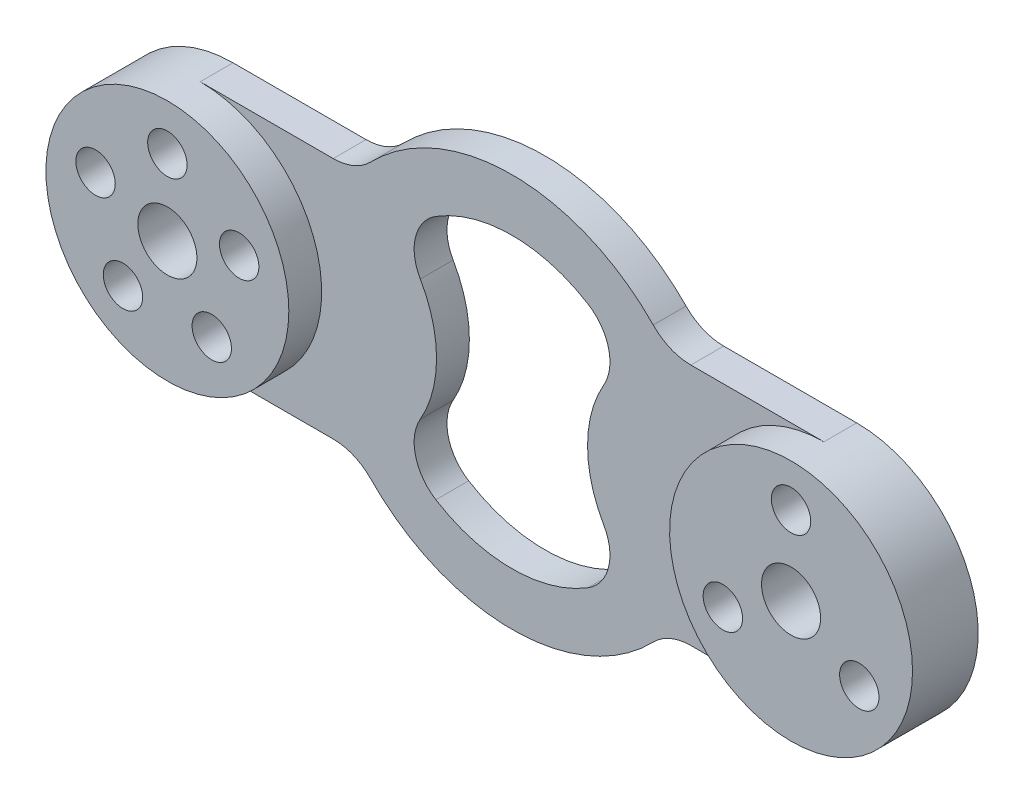
ISO-10303-21;
HEADER;
FILE_DESCRIPTION(('STEP AP214'),'2;1');
FILE_NAME('part.step','',(''),(''),'','','');
FILE_SCHEMA(('AUTOMOTIVE_DESIGN { 1 0 10303 214 1 1 1 1 }'));
ENDSEC;
DATA;
#1=APPLICATION_CONTEXT('core data for automotive mechanical design processes');
#2=APPLICATION_PROTOCOL_DEFINITION('international standard','automotive_design',2000,#1);
#3=PRODUCT_CONTEXT('',#1,'mechanical');
#4=PRODUCT('Part','Part','',(#3));
#5=PRODUCT_RELATED_PRODUCT_CATEGORY('part','',(#4));
#6=PRODUCT_DEFINITION_FORMATION('','',#4);
#7=PRODUCT_DEFINITION_CONTEXT('part definition',#1,'design');
#8=PRODUCT_DEFINITION('design','',#6,#7);
#9=PRODUCT_DEFINITION_SHAPE('','',#8);
#10=(LENGTH_UNIT() NAMED_UNIT(*) SI_UNIT(.MILLI.,.METRE.));
#11=(NAMED_UNIT(*) PLANE_ANGLE_UNIT() SI_UNIT($,.RADIAN.));
#12=(NAMED_UNIT(*) SI_UNIT($,.STERADIAN.) SOLID_ANGLE_UNIT());
#13=UNCERTAINTY_MEASURE_WITH_UNIT(LENGTH_MEASURE(1.E-05),#10,'distance_accuracy_value','');
#14=(GEOMETRIC_REPRESENTATION_CONTEXT(3) GLOBAL_UNCERTAINTY_ASSIGNED_CONTEXT((#13)) GLOBAL_UNIT_ASSIGNED_CONTEXT((#10,
#11,#12)) REPRESENTATION_CONTEXT('',''));
#15=CARTESIAN_POINT('',(0.,0.,0.));
#16=DIRECTION('',(0.,0.,1.));
#17=DIRECTION('',(1.,0.,0.));
#18=AXIS2_PLACEMENT_3D('',#15,#16,#17);
#19=CARTESIAN_POINT('',(54.4701753255853,53.,10.));
#20=DIRECTION('',(0.,0.,-1.));
#21=DIRECTION('',(-1.,0.,0.));
#22=AXIS2_PLACEMENT_3D('',#19,#20,#21);
#23=CYLINDRICAL_SURFACE('',#22,16.);
#24=CARTESIAN_POINT('',(54.4701753255853,53.,0.));
#25=DIRECTION('',(0.,0.,1.));
#26=DIRECTION('',(1.,0.,0.));
#27=AXIS2_PLACEMENT_3D('',#24,#25,#26);
#28=CIRCLE('',#27,16.);
#29=CARTESIAN_POINT('',(43.0027699938831,41.8421052631579,0.));
#30=VERTEX_POINT('',#29);
#31=CARTESIAN_POINT('',(54.4701753255853,37.,0.));
#32=VERTEX_POINT('',#31);
#33=EDGE_CURVE('E230',#30,#32,#28,.T.);
#34=ORIENTED_EDGE('',*,*,#33,.F.);
#35=DIRECTION('',(0.,0.,-1.));
#36=VECTOR('',#35,1.);
#37=CARTESIAN_POINT('',(43.0027699938831,41.8421052631579,10.));
#38=LINE('',#37,#36);
#39=CARTESIAN_POINT('',(43.0027699938831,41.8421052631579,10.));
#40=VERTEX_POINT('',#39);
#41=EDGE_CURVE('E11',#40,#30,#38,.T.);
#42=ORIENTED_EDGE('',*,*,#41,.F.);
#43=CARTESIAN_POINT('',(54.4701753255853,53.,10.));
#44=DIRECTION('',(0.,0.,1.));
#45=DIRECTION('',(1.,0.,0.));
#46=AXIS2_PLACEMENT_3D('',#43,#44,#45);
#47=CIRCLE('',#46,16.);
#48=CARTESIAN_POINT('',(54.4701753255853,37.,10.));
#49=VERTEX_POINT('',#48);
#50=EDGE_CURVE('E326',#40,#49,#47,.T.);
#51=ORIENTED_EDGE('',*,*,#50,.T.);
#52=DIRECTION('',(0.,0.,-1.));
#53=VECTOR('',#52,1.);
#54=CARTESIAN_POINT('',(54.4701753255853,37.,10.));
#55=LINE('',#54,#53);
#56=EDGE_CURVE('E122',#49,#32,#55,.T.);
#57=ORIENTED_EDGE('',*,*,#56,.T.);
#58=EDGE_LOOP('',(#34,#42,#51,#57));
#59=FACE_BOUND('',#58,.T.);
#60=ADVANCED_FACE('F36',(#59),#23,.F.);
#61=CARTESIAN_POINT('',(0.,0.,10.));
#62=DIRECTION('',(0.,0.,-1.));
#63=DIRECTION('',(-1.,0.,0.));
#64=AXIS2_PLACEMENT_3D('',#61,#62,#63);
#65=CYLINDRICAL_SURFACE('',#64,60.);
#66=CARTESIAN_POINT('',(0.,0.,0.));
#67=DIRECTION('',(0.,0.,1.));
#68=DIRECTION('',(1.,0.,0.));
#69=AXIS2_PLACEMENT_3D('',#66,#67,#68);
#70=CIRCLE('',#69,60.);
#71=CARTESIAN_POINT('',(-43.0027699938831,41.8421052631579,0.));
#72=VERTEX_POINT('',#71);
#73=EDGE_CURVE('E233',#30,#72,#70,.T.);
#74=ORIENTED_EDGE('',*,*,#73,.T.);
#75=DIRECTION('',(0.,0.,-1.));
#76=VECTOR('',#75,1.);
#77=CARTESIAN_POINT('',(-43.0027699938831,41.8421052631579,10.));
#78=LINE('',#77,#76);
#79=CARTESIAN_POINT('',(-43.0027699938831,41.8421052631579,10.));
#80=VERTEX_POINT('',#79);
#81=EDGE_CURVE('E46',#80,#72,#78,.T.);
#82=ORIENTED_EDGE('',*,*,#81,.F.);
#83=CARTESIAN_POINT('',(0.,0.,10.));
#84=DIRECTION('',(0.,0.,1.));
#85=DIRECTION('',(1.,0.,0.));
#86=AXIS2_PLACEMENT_3D('',#83,#84,#85);
#87=CIRCLE('',#86,60.);
#88=EDGE_CURVE('E328',#40,#80,#87,.T.);
#89=ORIENTED_EDGE('',*,*,#88,.F.);
#90=ORIENTED_EDGE('',*,*,#41,.T.);
#91=EDGE_LOOP('',(#74,#82,#89,#90));
#92=FACE_BOUND('',#91,.T.);
#93=ADVANCED_FACE('F412',(#92),#65,.T.);
#94=CARTESIAN_POINT('',(-54.4701753255853,53.,10.));
#95=DIRECTION('',(0.,0.,-1.));
#96=DIRECTION('',(-1.,0.,0.));
#97=AXIS2_PLACEMENT_3D('',#94,#95,#96);
#98=CYLINDRICAL_SURFACE('',#97,16.);
#99=CARTESIAN_POINT('',(-54.4701753255853,53.,0.));
#100=DIRECTION('',(0.,0.,1.));
#101=DIRECTION('',(1.,0.,0.));
#102=AXIS2_PLACEMENT_3D('',#99,#100,#101);
#103=CIRCLE('',#102,16.);
#104=CARTESIAN_POINT('',(-54.4701753255853,37.,0.));
#105=VERTEX_POINT('',#104);
#106=EDGE_CURVE('E236',#105,#72,#103,.T.);
#107=ORIENTED_EDGE('',*,*,#106,.F.);
#108=DIRECTION('',(0.,0.,-1.));
#109=VECTOR('',#108,1.);
#110=CARTESIAN_POINT('',(-54.4701753255853,37.,10.));
#111=LINE('',#110,#109);
#112=CARTESIAN_POINT('',(-54.4701753255853,37.,10.));
#113=VERTEX_POINT('',#112);
#114=EDGE_CURVE('E272',#113,#105,#111,.T.);
#115=ORIENTED_EDGE('',*,*,#114,.F.);
#116=CARTESIAN_POINT('',(-54.4701753255853,53.,10.));
#117=DIRECTION('',(0.,0.,1.));
#118=DIRECTION('',(1.,0.,0.));
#119=AXIS2_PLACEMENT_3D('',#116,#117,#118);
#120=CIRCLE('',#119,16.);
#121=EDGE_CURVE('E330',#113,#80,#120,.T.);
#122=ORIENTED_EDGE('',*,*,#121,.T.);
#123=ORIENTED_EDGE('',*,*,#81,.T.);
#124=EDGE_LOOP('',(#107,#115,#122,#123));
#125=FACE_BOUND('',#124,.T.);
#126=ADVANCED_FACE('F417',(#125),#98,.F.);
#127=CARTESIAN_POINT('',(0.,37.,10.));
#128=DIRECTION('',(0.,1.,0.));
#129=DIRECTION('',(-1.,0.,0.));
#130=AXIS2_PLACEMENT_3D('',#127,#128,#129);
#131=PLANE('',#130);
#132=DIRECTION('',(1.,0.,0.));
#133=VECTOR('',#132,1.);
#134=CARTESIAN_POINT('',(0.,37.,0.));
#135=LINE('',#134,#133);
#136=CARTESIAN_POINT('',(-95.,37.,0.));
#137=VERTEX_POINT('',#136);
#138=EDGE_CURVE('E239',#137,#105,#135,.T.);
#139=ORIENTED_EDGE('',*,*,#138,.F.);
#140=DIRECTION('',(0.,0.,-1.));
#141=VECTOR('',#140,1.);
#142=CARTESIAN_POINT('',(-95.,37.,10.));
#143=LINE('',#142,#141);
#144=CARTESIAN_POINT('',(-95.,37.,10.));
#145=VERTEX_POINT('',#144);
#146=EDGE_CURVE('E269',#145,#137,#143,.T.);
#147=ORIENTED_EDGE('',*,*,#146,.F.);
#148=DIRECTION('',(1.,0.,0.));
#149=VECTOR('',#148,1.);
#150=CARTESIAN_POINT('',(0.,37.,10.));
#151=LINE('',#150,#149);
#152=EDGE_CURVE('E333',#145,#113,#151,.T.);
#153=ORIENTED_EDGE('',*,*,#152,.T.);
#154=ORIENTED_EDGE('',*,*,#114,.T.);
#155=EDGE_LOOP('',(#139,#147,#153,#154));
#156=FACE_BOUND('',#155,.T.);
#157=ADVANCED_FACE('F376',(#156),#131,.T.);
#158=CARTESIAN_POINT('',(0.,-37.,10.));
#159=DIRECTION('',(0.,1.,0.));
#160=DIRECTION('',(0.,0.,1.));
#161=AXIS2_PLACEMENT_3D('',#158,#159,#160);
#162=PLANE('',#161);
#163=DIRECTION('',(1.,0.,0.));
#164=VECTOR('',#163,1.);
#165=CARTESIAN_POINT('',(0.,-37.,0.));
#166=LINE('',#165,#164);
#167=CARTESIAN_POINT('',(-95.,-37.,0.));
#168=VERTEX_POINT('',#167);
#169=CARTESIAN_POINT('',(-54.4701753255853,-37.,0.));
#170=VERTEX_POINT('',#169);
#171=EDGE_CURVE('E242',#168,#170,#166,.T.);
#172=ORIENTED_EDGE('',*,*,#171,.T.);
#173=DIRECTION('',(0.,0.,-1.));
#174=VECTOR('',#173,1.);
#175=CARTESIAN_POINT('',(-54.4701753255853,-37.,10.));
#176=LINE('',#175,#174);
#177=CARTESIAN_POINT('',(-54.4701753255853,-37.,10.));
#178=VERTEX_POINT('',#177);
#179=EDGE_CURVE('E264',#178,#170,#176,.T.);
#180=ORIENTED_EDGE('',*,*,#179,.F.);
#181=DIRECTION('',(1.,0.,0.));
#182=VECTOR('',#181,1.);
#183=CARTESIAN_POINT('',(0.,-37.,10.));
#184=LINE('',#183,#182);
#185=CARTESIAN_POINT('',(-95.,-37.,10.));
#186=VERTEX_POINT('',#185);
#187=EDGE_CURVE('E339',#186,#178,#184,.T.);
#188=ORIENTED_EDGE('',*,*,#187,.F.);
#189=DIRECTION('',(0.,0.,-1.));
#190=VECTOR('',#189,1.);
#191=CARTESIAN_POINT('',(-95.,-37.,10.));
#192=LINE('',#191,#190);
#193=EDGE_CURVE('E266',#186,#168,#192,.T.);
#194=ORIENTED_EDGE('',*,*,#193,.T.);
#195=EDGE_LOOP('',(#172,#180,#188,#194));
#196=FACE_BOUND('',#195,.T.);
#197=ADVANCED_FACE('F371',(#196),#162,.F.);
#198=CARTESIAN_POINT('',(-54.4701753255853,-53.,10.));
#199=DIRECTION('',(0.,0.,-1.));
#200=DIRECTION('',(-1.,0.,0.));
#201=AXIS2_PLACEMENT_3D('',#198,#199,#200);
#202=CYLINDRICAL_SURFACE('',#201,16.);
#203=CARTESIAN_POINT('',(-54.4701753255853,-53.,0.));
#204=DIRECTION('',(0.,0.,1.));
#205=DIRECTION('',(1.,0.,0.));
#206=AXIS2_PLACEMENT_3D('',#203,#204,#205);
#207=CIRCLE('',#206,16.);
#208=CARTESIAN_POINT('',(-43.0027699938831,-41.8421052631579,0.));
#209=VERTEX_POINT('',#208);
#210=EDGE_CURVE('E245',#209,#170,#207,.T.);
#211=ORIENTED_EDGE('',*,*,#210,.F.);
#212=DIRECTION('',(0.,0.,-1.));
#213=VECTOR('',#212,1.);
#214=CARTESIAN_POINT('',(-43.0027699938831,-41.8421052631579,10.));
#215=LINE('',#214,#213);
#216=CARTESIAN_POINT('',(-43.0027699938831,-41.8421052631579,10.));
#217=VERTEX_POINT('',#216);
#218=EDGE_CURVE('E191',#217,#209,#215,.T.);
#219=ORIENTED_EDGE('',*,*,#218,.F.);
#220=CARTESIAN_POINT('',(-54.4701753255853,-53.,10.));
#221=DIRECTION('',(0.,0.,1.));
#222=DIRECTION('',(1.,0.,0.));
#223=AXIS2_PLACEMENT_3D('',#220,#221,#222);
#224=CIRCLE('',#223,16.);
#225=EDGE_CURVE('E180',#217,#178,#224,.T.);
#226=ORIENTED_EDGE('',*,*,#225,.T.);
#227=ORIENTED_EDGE('',*,*,#179,.T.);
#228=EDGE_LOOP('',(#211,#219,#226,#227));
#229=FACE_BOUND('',#228,.T.);
#230=ADVANCED_FACE('F342',(#229),#202,.F.);
#231=CARTESIAN_POINT('',(0.,0.,10.));
#232=DIRECTION('',(0.,0.,-1.));
#233=DIRECTION('',(-1.,0.,0.));
#234=AXIS2_PLACEMENT_3D('',#231,#232,#233);
#235=CYLINDRICAL_SURFACE('',#234,60.);
#236=CARTESIAN_POINT('',(0.,0.,0.));
#237=DIRECTION('',(0.,0.,1.));
#238=DIRECTION('',(1.,0.,0.));
#239=AXIS2_PLACEMENT_3D('',#236,#237,#238);
#240=CIRCLE('',#239,60.);
#241=CARTESIAN_POINT('',(43.0027699938831,-41.8421052631579,0.));
#242=VERTEX_POINT('',#241);
#243=EDGE_CURVE('E187',#209,#242,#240,.T.);
#244=ORIENTED_EDGE('',*,*,#243,.T.);
#245=DIRECTION('',(0.,0.,-1.));
#246=VECTOR('',#245,1.);
#247=CARTESIAN_POINT('',(43.0027699938831,-41.8421052631579,10.));
#248=LINE('',#247,#246);
#249=CARTESIAN_POINT('',(43.0027699938831,-41.8421052631579,10.));
#250=VERTEX_POINT('',#249);
#251=EDGE_CURVE('E184',#250,#242,#248,.T.);
#252=ORIENTED_EDGE('',*,*,#251,.F.);
#253=CARTESIAN_POINT('',(0.,0.,10.));
#254=DIRECTION('',(0.,0.,1.));
#255=DIRECTION('',(1.,0.,0.));
#256=AXIS2_PLACEMENT_3D('',#253,#254,#255);
#257=CIRCLE('',#256,60.);
#258=EDGE_CURVE('E172',#217,#250,#257,.T.);
#259=ORIENTED_EDGE('',*,*,#258,.F.);
#260=ORIENTED_EDGE('',*,*,#218,.T.);
#261=EDGE_LOOP('',(#244,#252,#259,#260));
#262=FACE_BOUND('',#261,.T.);
#263=ADVANCED_FACE('F185',(#262),#235,.T.);
#264=CARTESIAN_POINT('',(54.4701753255853,-53.,10.));
#265=DIRECTION('',(0.,0.,-1.));
#266=DIRECTION('',(-1.,0.,0.));
#267=AXIS2_PLACEMENT_3D('',#264,#265,#266);
#268=CYLINDRICAL_SURFACE('',#267,16.);
#269=CARTESIAN_POINT('',(54.4701753255853,-53.,0.));
#270=DIRECTION('',(0.,0.,1.));
#271=DIRECTION('',(1.,0.,0.));
#272=AXIS2_PLACEMENT_3D('',#269,#270,#271);
#273=CIRCLE('',#272,16.);
#274=CARTESIAN_POINT('',(54.4701753255853,-37.,0.));
#275=VERTEX_POINT('',#274);
#276=EDGE_CURVE('E249',#275,#242,#273,.T.);
#277=ORIENTED_EDGE('',*,*,#276,.F.);
#278=DIRECTION('',(0.,0.,-1.));
#279=VECTOR('',#278,1.);
#280=CARTESIAN_POINT('',(54.4701753255853,-37.,10.));
#281=LINE('',#280,#279);
#282=CARTESIAN_POINT('',(54.4701753255853,-37.,10.));
#283=VERTEX_POINT('',#282);
#284=EDGE_CURVE('E192',#283,#275,#281,.T.);
#285=ORIENTED_EDGE('',*,*,#284,.F.);
#286=CARTESIAN_POINT('',(54.4701753255853,-53.,10.));
#287=DIRECTION('',(0.,0.,1.));
#288=DIRECTION('',(1.,0.,0.));
#289=AXIS2_PLACEMENT_3D('',#286,#287,#288);
#290=CIRCLE('',#289,16.);
#291=EDGE_CURVE('E177',#283,#250,#290,.T.);
#292=ORIENTED_EDGE('',*,*,#291,.T.);
#293=ORIENTED_EDGE('',*,*,#251,.T.);
#294=EDGE_LOOP('',(#277,#285,#292,#293));
#295=FACE_BOUND('',#294,.T.);
#296=ADVANCED_FACE('F194',(#295),#268,.F.);
#297=CARTESIAN_POINT('',(0.,-37.,10.));
#298=DIRECTION('',(0.,-1.,0.));
#299=DIRECTION('',(0.,0.,-1.));
#300=AXIS2_PLACEMENT_3D('',#297,#298,#299);
#301=PLANE('',#300);
#302=DIRECTION('',(-1.,0.,0.));
#303=VECTOR('',#302,1.);
#304=CARTESIAN_POINT('',(0.,-37.,0.));
#305=LINE('',#304,#303);
#306=CARTESIAN_POINT('',(95.,-37.,0.));
#307=VERTEX_POINT('',#306);
#308=EDGE_CURVE('E251',#307,#275,#305,.T.);
#309=ORIENTED_EDGE('',*,*,#308,.F.);
#310=DIRECTION('',(0.,0.,-1.));
#311=VECTOR('',#310,1.);
#312=CARTESIAN_POINT('',(95.,-37.,10.));
#313=LINE('',#312,#311);
#314=CARTESIAN_POINT('',(95.,-37.,10.));
#315=VERTEX_POINT('',#314);
#316=EDGE_CURVE('E260',#315,#307,#313,.T.);
#317=ORIENTED_EDGE('',*,*,#316,.F.);
#318=DIRECTION('',(-1.,0.,0.));
#319=VECTOR('',#318,1.);
#320=CARTESIAN_POINT('',(0.,-37.,10.));
#321=LINE('',#320,#319);
#322=EDGE_CURVE('E195',#315,#283,#321,.T.);
#323=ORIENTED_EDGE('',*,*,#322,.T.);
#324=ORIENTED_EDGE('',*,*,#284,.T.);
#325=EDGE_LOOP('',(#309,#317,#323,#324));
#326=FACE_BOUND('',#325,.T.);
#327=ADVANCED_FACE('F349',(#326),#301,.T.);
#328=CARTESIAN_POINT('',(15.825,-25.4866509176863,10.));
#329=DIRECTION('',(0.,0.,-1.));
#330=DIRECTION('',(-1.,0.,0.));
#331=AXIS2_PLACEMENT_3D('',#328,#329,#330);
#332=CYLINDRICAL_SURFACE('',#331,14.);
#333=CARTESIAN_POINT('',(15.825,-25.4866509176863,0.));
#334=DIRECTION('',(0.,0.,1.));
#335=DIRECTION('',(1.,0.,0.));
#336=AXIS2_PLACEMENT_3D('',#333,#334,#335);
#337=CIRCLE('',#336,14.);
#338=CARTESIAN_POINT('',(23.21,-37.3804213459399,0.));
#339=VERTEX_POINT('',#338);
#340=CARTESIAN_POINT('',(27.9514705882353,-18.4903153716548,0.));
#341=VERTEX_POINT('',#340);
#342=EDGE_CURVE('E205',#339,#341,#337,.T.);
#343=ORIENTED_EDGE('',*,*,#342,.F.);
#344=DIRECTION('',(0.,0.,-1.));
#345=VECTOR('',#344,1.);
#346=CARTESIAN_POINT('',(23.21,-37.3804213459399,10.));
#347=LINE('',#346,#345);
#348=CARTESIAN_POINT('',(23.21,-37.3804213459399,10.));
#349=VERTEX_POINT('',#348);
#350=EDGE_CURVE('E40',#349,#339,#347,.T.);
#351=ORIENTED_EDGE('',*,*,#350,.F.);
#352=CARTESIAN_POINT('',(15.825,-25.4866509176863,10.));
#353=DIRECTION('',(0.,0.,1.));
#354=DIRECTION('',(1.,0.,0.));
#355=AXIS2_PLACEMENT_3D('',#352,#353,#354);
#356=CIRCLE('',#355,14.);
#357=CARTESIAN_POINT('',(27.9514705882353,-18.4903153716548,10.));
#358=VERTEX_POINT('',#357);
#359=EDGE_CURVE('E255',#349,#358,#356,.T.);
#360=ORIENTED_EDGE('',*,*,#359,.T.);
#361=DIRECTION('',(0.,0.,-1.));
#362=VECTOR('',#361,1.);
#363=CARTESIAN_POINT('',(27.9514705882353,-18.4903153716548,10.));
#364=LINE('',#363,#362);
#365=EDGE_CURVE('E204',#358,#341,#364,.T.);
#366=ORIENTED_EDGE('',*,*,#365,.T.);
#367=EDGE_LOOP('',(#343,#351,#360,#366));
#368=FACE_BOUND('',#367,.T.);
#369=ADVANCED_FACE('F38',(#368),#332,.F.);
#370=CARTESIAN_POINT('',(0.,0.,10.));
#371=DIRECTION('',(0.,0.,-1.));
#372=DIRECTION('',(-1.,0.,0.));
#373=AXIS2_PLACEMENT_3D('',#370,#371,#372);
#374=CYLINDRICAL_SURFACE('',#373,44.);
#375=CARTESIAN_POINT('',(0.,0.,0.));
#376=DIRECTION('',(0.,0.,1.));
#377=DIRECTION('',(1.,0.,0.));
#378=AXIS2_PLACEMENT_3D('',#375,#376,#377);
#379=CIRCLE('',#378,44.);
#380=CARTESIAN_POINT('',(-23.21,-37.3804213459399,0.));
#381=VERTEX_POINT('',#380);
#382=EDGE_CURVE('E208',#381,#339,#379,.T.);
#383=ORIENTED_EDGE('',*,*,#382,.F.);
#384=DIRECTION('',(0.,0.,-1.));
#385=VECTOR('',#384,1.);
#386=CARTESIAN_POINT('',(-23.21,-37.3804213459399,10.));
#387=LINE('',#386,#385);
#388=CARTESIAN_POINT('',(-23.21,-37.3804213459399,10.));
#389=VERTEX_POINT('',#388);
#390=EDGE_CURVE('E285',#389,#381,#387,.T.);
#391=ORIENTED_EDGE('',*,*,#390,.F.);
#392=CARTESIAN_POINT('',(0.,0.,10.));
#393=DIRECTION('',(0.,0.,1.));
#394=DIRECTION('',(1.,0.,0.));
#395=AXIS2_PLACEMENT_3D('',#392,#393,#394);
#396=CIRCLE('',#395,44.);
#397=EDGE_CURVE('E294',#389,#349,#396,.T.);
#398=ORIENTED_EDGE('',*,*,#397,.T.);
#399=ORIENTED_EDGE('',*,*,#350,.T.);
#400=EDGE_LOOP('',(#383,#391,#398,#399));
#401=FACE_BOUND('',#400,.T.);
#402=ADVANCED_FACE('F292',(#401),#374,.F.);
#403=CARTESIAN_POINT('',(-15.825,-25.4866509176863,10.));
#404=DIRECTION('',(0.,0.,-1.));
#405=DIRECTION('',(-1.,0.,0.));
#406=AXIS2_PLACEMENT_3D('',#403,#404,#405);
#407=CYLINDRICAL_SURFACE('',#406,14.);
#408=CARTESIAN_POINT('',(-15.825,-25.4866509176863,0.));
#409=DIRECTION('',(0.,0.,1.));
#410=DIRECTION('',(1.,0.,0.));
#411=AXIS2_PLACEMENT_3D('',#408,#409,#410);
#412=CIRCLE('',#411,14.);
#413=CARTESIAN_POINT('',(-27.9514705882353,-18.4903153716548,0.));
#414=VERTEX_POINT('',#413);
#415=EDGE_CURVE('E212',#414,#381,#412,.T.);
#416=ORIENTED_EDGE('',*,*,#415,.F.);
#417=DIRECTION('',(0.,0.,-1.));
#418=VECTOR('',#417,1.);
#419=CARTESIAN_POINT('',(-27.9514705882353,-18.4903153716548,10.));
#420=LINE('',#419,#418);
#421=CARTESIAN_POINT('',(-27.9514705882353,-18.4903153716548,10.));
#422=VERTEX_POINT('',#421);
#423=EDGE_CURVE('E284',#422,#414,#420,.T.);
#424=ORIENTED_EDGE('',*,*,#423,.F.);
#425=CARTESIAN_POINT('',(-15.825,-25.4866509176863,10.));
#426=DIRECTION('',(0.,0.,1.));
#427=DIRECTION('',(1.,0.,0.));
#428=AXIS2_PLACEMENT_3D('',#425,#426,#427);
#429=CIRCLE('',#428,14.);
#430=EDGE_CURVE('E303',#422,#389,#429,.T.);
#431=ORIENTED_EDGE('',*,*,#430,.T.);
#432=ORIENTED_EDGE('',*,*,#390,.T.);
#433=EDGE_LOOP('',(#416,#424,#431,#432));
#434=FACE_BOUND('',#433,.T.);
#435=ADVANCED_FACE('F300',(#434),#407,.F.);
#436=CARTESIAN_POINT('',(-60.,0.,10.));
#437=DIRECTION('',(0.,0.,-1.));
#438=DIRECTION('',(-1.,0.,0.));
#439=AXIS2_PLACEMENT_3D('',#436,#437,#438);
#440=CYLINDRICAL_SURFACE('',#439,37.);
#441=CARTESIAN_POINT('',(-60.,0.,0.));
#442=DIRECTION('',(0.,0.,1.));
#443=DIRECTION('',(1.,0.,0.));
#444=AXIS2_PLACEMENT_3D('',#441,#442,#443);
#445=CIRCLE('',#444,37.);
#446=CARTESIAN_POINT('',(-27.9514705882353,18.4903153716548,0.));
#447=VERTEX_POINT('',#446);
#448=EDGE_CURVE('E215',#414,#447,#445,.T.);
#449=ORIENTED_EDGE('',*,*,#448,.T.);
#450=DIRECTION('',(0.,0.,-1.));
#451=VECTOR('',#450,1.);
#452=CARTESIAN_POINT('',(-27.9514705882353,18.4903153716548,10.));
#453=LINE('',#452,#451);
#454=CARTESIAN_POINT('',(-27.9514705882353,18.4903153716548,10.));
#455=VERTEX_POINT('',#454);
#456=EDGE_CURVE('E282',#455,#447,#453,.T.);
#457=ORIENTED_EDGE('',*,*,#456,.F.);
#458=CARTESIAN_POINT('',(-60.,0.,10.));
#459=DIRECTION('',(0.,0.,1.));
#460=DIRECTION('',(1.,0.,0.));
#461=AXIS2_PLACEMENT_3D('',#458,#459,#460);
#462=CIRCLE('',#461,37.);
#463=EDGE_CURVE('E306',#422,#455,#462,.T.);
#464=ORIENTED_EDGE('',*,*,#463,.F.);
#465=ORIENTED_EDGE('',*,*,#423,.T.);
#466=EDGE_LOOP('',(#449,#457,#464,#465));
#467=FACE_BOUND('',#466,.T.);
#468=ADVANCED_FACE('F307',(#467),#440,.T.);
#469=CARTESIAN_POINT('',(-15.825,25.4866509176863,10.));
#470=DIRECTION('',(0.,0.,-1.));
#471=DIRECTION('',(-1.,0.,0.));
#472=AXIS2_PLACEMENT_3D('',#469,#470,#471);
#473=CYLINDRICAL_SURFACE('',#472,14.);
#474=CARTESIAN_POINT('',(-15.825,25.4866509176863,0.));
#475=DIRECTION('',(0.,0.,1.));
#476=DIRECTION('',(1.,0.,0.));
#477=AXIS2_PLACEMENT_3D('',#474,#475,#476);
#478=CIRCLE('',#477,14.);
#479=CARTESIAN_POINT('',(-23.21,37.3804213459399,0.));
#480=VERTEX_POINT('',#479);
#481=EDGE_CURVE('E218',#480,#447,#478,.T.);
#482=ORIENTED_EDGE('',*,*,#481,.F.);
#483=DIRECTION('',(0.,0.,-1.));
#484=VECTOR('',#483,1.);
#485=CARTESIAN_POINT('',(-23.21,37.3804213459399,10.));
#486=LINE('',#485,#484);
#487=CARTESIAN_POINT('',(-23.21,37.3804213459399,10.));
#488=VERTEX_POINT('',#487);
#489=EDGE_CURVE('E280',#488,#480,#486,.T.);
#490=ORIENTED_EDGE('',*,*,#489,.F.);
#491=CARTESIAN_POINT('',(-15.825,25.4866509176863,10.));
#492=DIRECTION('',(0.,0.,1.));
#493=DIRECTION('',(1.,0.,0.));
#494=AXIS2_PLACEMENT_3D('',#491,#492,#493);
#495=CIRCLE('',#494,14.);
#496=EDGE_CURVE('E311',#488,#455,#495,.T.);
#497=ORIENTED_EDGE('',*,*,#496,.T.);
#498=ORIENTED_EDGE('',*,*,#456,.T.);
#499=EDGE_LOOP('',(#482,#490,#497,#498));
#500=FACE_BOUND('',#499,.T.);
#501=ADVANCED_FACE('F402',(#500),#473,.F.);
#502=CARTESIAN_POINT('',(0.,0.,10.));
#503=DIRECTION('',(0.,0.,-1.));
#504=DIRECTION('',(-1.,0.,0.));
#505=AXIS2_PLACEMENT_3D('',#502,#503,#504);
#506=CYLINDRICAL_SURFACE('',#505,44.);
#507=CARTESIAN_POINT('',(0.,0.,0.));
#508=DIRECTION('',(0.,0.,1.));
#509=DIRECTION('',(1.,0.,0.));
#510=AXIS2_PLACEMENT_3D('',#507,#508,#509);
#511=CIRCLE('',#510,44.);
#512=CARTESIAN_POINT('',(23.21,37.3804213459399,0.));
#513=VERTEX_POINT('',#512);
#514=EDGE_CURVE('E221',#513,#480,#511,.T.);
#515=ORIENTED_EDGE('',*,*,#514,.F.);
#516=DIRECTION('',(0.,0.,-1.));
#517=VECTOR('',#516,1.);
#518=CARTESIAN_POINT('',(23.21,37.3804213459399,10.));
#519=LINE('',#518,#517);
#520=CARTESIAN_POINT('',(23.21,37.3804213459399,10.));
#521=VERTEX_POINT('',#520);
#522=EDGE_CURVE('E278',#521,#513,#519,.T.);
#523=ORIENTED_EDGE('',*,*,#522,.F.);
#524=CARTESIAN_POINT('',(0.,0.,10.));
#525=DIRECTION('',(0.,0.,1.));
#526=DIRECTION('',(1.,0.,0.));
#527=AXIS2_PLACEMENT_3D('',#524,#525,#526);
#528=CIRCLE('',#527,44.);
#529=EDGE_CURVE('E318',#521,#488,#528,.T.);
#530=ORIENTED_EDGE('',*,*,#529,.T.);
#531=ORIENTED_EDGE('',*,*,#489,.T.);
#532=EDGE_LOOP('',(#515,#523,#530,#531));
#533=FACE_BOUND('',#532,.T.);
#534=ADVANCED_FACE('F399',(#533),#506,.F.);
#535=CARTESIAN_POINT('',(15.825,25.4866509176863,10.));
#536=DIRECTION('',(0.,0.,-1.));
#537=DIRECTION('',(-1.,0.,0.));
#538=AXIS2_PLACEMENT_3D('',#535,#536,#537);
#539=CYLINDRICAL_SURFACE('',#538,14.);
#540=CARTESIAN_POINT('',(15.825,25.4866509176863,0.));
#541=DIRECTION('',(0.,0.,1.));
#542=DIRECTION('',(1.,0.,0.));
#543=AXIS2_PLACEMENT_3D('',#540,#541,#542);
#544=CIRCLE('',#543,14.);
#545=CARTESIAN_POINT('',(27.9514705882353,18.4903153716548,0.));
#546=VERTEX_POINT('',#545);
#547=EDGE_CURVE('E224',#546,#513,#544,.T.);
#548=ORIENTED_EDGE('',*,*,#547,.F.);
#549=DIRECTION('',(0.,0.,-1.));
#550=VECTOR('',#549,1.);
#551=CARTESIAN_POINT('',(27.9514705882353,18.4903153716548,10.));
#552=LINE('',#551,#550);
#553=CARTESIAN_POINT('',(27.9514705882353,18.4903153716548,10.));
#554=VERTEX_POINT('',#553);
#555=EDGE_CURVE('E276',#554,#546,#552,.T.);
#556=ORIENTED_EDGE('',*,*,#555,.F.);
#557=CARTESIAN_POINT('',(15.825,25.4866509176863,10.));
#558=DIRECTION('',(0.,0.,1.));
#559=DIRECTION('',(1.,0.,0.));
#560=AXIS2_PLACEMENT_3D('',#557,#558,#559);
#561=CIRCLE('',#560,14.);
#562=EDGE_CURVE('E321',#554,#521,#561,.T.);
#563=ORIENTED_EDGE('',*,*,#562,.T.);
#564=ORIENTED_EDGE('',*,*,#522,.T.);
#565=EDGE_LOOP('',(#548,#556,#563,#564));
#566=FACE_BOUND('',#565,.T.);
#567=ADVANCED_FACE('F396',(#566),#539,.F.);
#568=CARTESIAN_POINT('',(60.,0.,10.));
#569=DIRECTION('',(0.,0.,-1.));
#570=DIRECTION('',(-1.,0.,0.));
#571=AXIS2_PLACEMENT_3D('',#568,#569,#570);
#572=CYLINDRICAL_SURFACE('',#571,37.);
#573=CARTESIAN_POINT('',(60.,0.,0.));
#574=DIRECTION('',(0.,0.,1.));
#575=DIRECTION('',(1.,0.,0.));
#576=AXIS2_PLACEMENT_3D('',#573,#574,#575);
#577=CIRCLE('',#576,37.);
#578=EDGE_CURVE('E227',#546,#341,#577,.T.);
#579=ORIENTED_EDGE('',*,*,#578,.T.);
#580=ORIENTED_EDGE('',*,*,#365,.F.);
#581=CARTESIAN_POINT('',(60.,0.,10.));
#582=DIRECTION('',(0.,0.,1.));
#583=DIRECTION('',(1.,0.,0.));
#584=AXIS2_PLACEMENT_3D('',#581,#582,#583);
#585=CIRCLE('',#584,37.);
#586=EDGE_CURVE('E324',#554,#358,#585,.T.);
#587=ORIENTED_EDGE('',*,*,#586,.F.);
#588=ORIENTED_EDGE('',*,*,#555,.T.);
#589=EDGE_LOOP('',(#579,#580,#587,#588));
#590=FACE_BOUND('',#589,.T.);
#591=ADVANCED_FACE('F393',(#590),#572,.T.);
#592=CARTESIAN_POINT('',(0.,37.,10.));
#593=DIRECTION('',(0.,-1.,0.));
#594=DIRECTION('',(1.,0.,0.));
#595=AXIS2_PLACEMENT_3D('',#592,#593,#594);
#596=PLANE('',#595);
#597=DIRECTION('',(-1.,0.,0.));
#598=VECTOR('',#597,1.);
#599=CARTESIAN_POINT('',(0.,37.,0.));
#600=LINE('',#599,#598);
#601=CARTESIAN_POINT('',(95.,37.,0.));
#602=VERTEX_POINT('',#601);
#603=EDGE_CURVE('E253',#602,#32,#600,.T.);
#604=ORIENTED_EDGE('',*,*,#603,.T.);
#605=ORIENTED_EDGE('',*,*,#56,.F.);
#606=DIRECTION('',(-1.,0.,0.));
#607=VECTOR('',#606,1.);
#608=CARTESIAN_POINT('',(0.,37.,10.));
#609=LINE('',#608,#607);
#610=CARTESIAN_POINT('',(95.,37.,10.));
#611=VERTEX_POINT('',#610);
#612=EDGE_CURVE('E55',#611,#49,#609,.T.);
#613=ORIENTED_EDGE('',*,*,#612,.F.);
#614=DIRECTION('',(0.,0.,-1.));
#615=VECTOR('',#614,1.);
#616=CARTESIAN_POINT('',(95.,37.,10.));
#617=LINE('',#616,#615);
#618=EDGE_CURVE('E257',#611,#602,#617,.T.);
#619=ORIENTED_EDGE('',*,*,#618,.T.);
#620=EDGE_LOOP('',(#604,#605,#613,#619));
#621=FACE_BOUND('',#620,.T.);
#622=ADVANCED_FACE('F424',(#621),#596,.F.);
#623=CARTESIAN_POINT('',(0.,0.,10.));
#624=DIRECTION('',(0.,0.,1.));
#625=DIRECTION('',(1.,0.,0.));
#626=AXIS2_PLACEMENT_3D('',#623,#624,#625);
#627=PLANE('',#626);
#628=ORIENTED_EDGE('',*,*,#359,.F.);
#629=ORIENTED_EDGE('',*,*,#397,.F.);
#630=ORIENTED_EDGE('',*,*,#430,.F.);
#631=ORIENTED_EDGE('',*,*,#463,.T.);
#632=ORIENTED_EDGE('',*,*,#496,.F.);
#633=ORIENTED_EDGE('',*,*,#529,.F.);
#634=ORIENTED_EDGE('',*,*,#562,.F.);
#635=ORIENTED_EDGE('',*,*,#586,.T.);
#636=EDGE_LOOP('',(#628,#629,#630,#631,#632,#633,#634,#635));
#637=FACE_BOUND('',#636,.T.);
#638=ORIENTED_EDGE('',*,*,#50,.F.);
#639=ORIENTED_EDGE('',*,*,#88,.T.);
#640=ORIENTED_EDGE('',*,*,#121,.F.);
#641=ORIENTED_EDGE('',*,*,#152,.F.);
#642=CARTESIAN_POINT('',(-95.,0.,10.));
#643=DIRECTION('',(0.,0.,1.));
#644=DIRECTION('',(1.,0.,0.));
#645=AXIS2_PLACEMENT_3D('',#642,#643,#644);
#646=CIRCLE('',#645,37.);
#647=EDGE_CURVE('E336',#186,#145,#646,.T.);
#648=ORIENTED_EDGE('',*,*,#647,.F.);
#649=ORIENTED_EDGE('',*,*,#187,.T.);
#650=ORIENTED_EDGE('',*,*,#225,.F.);
#651=ORIENTED_EDGE('',*,*,#258,.T.);
#652=ORIENTED_EDGE('',*,*,#291,.F.);
#653=ORIENTED_EDGE('',*,*,#322,.F.);
#654=CARTESIAN_POINT('',(95.,0.,10.));
#655=DIRECTION('',(0.,0.,1.));
#656=DIRECTION('',(1.,0.,0.));
#657=AXIS2_PLACEMENT_3D('',#654,#655,#656);
#658=CIRCLE('',#657,37.);
#659=EDGE_CURVE('E197',#611,#315,#658,.T.);
#660=ORIENTED_EDGE('',*,*,#659,.F.);
#661=ORIENTED_EDGE('',*,*,#612,.T.);
#662=EDGE_LOOP('',(#638,#639,#640,#641,#648,#649,#650,#651,#652,#653,#660,#661));
#663=FACE_BOUND('',#662,.T.);
#664=ADVANCED_FACE('F174',(#637,#663),#627,.T.);
#665=CARTESIAN_POINT('',(0.,0.,0.));
#666=DIRECTION('',(0.,0.,1.));
#667=DIRECTION('',(1.,0.,0.));
#668=AXIS2_PLACEMENT_3D('',#665,#666,#667);
#669=PLANE('',#668);
#670=ORIENTED_EDGE('',*,*,#342,.T.);
#671=ORIENTED_EDGE('',*,*,#578,.F.);
#672=ORIENTED_EDGE('',*,*,#547,.T.);
#673=ORIENTED_EDGE('',*,*,#514,.T.);
#674=ORIENTED_EDGE('',*,*,#481,.T.);
#675=ORIENTED_EDGE('',*,*,#448,.F.);
#676=ORIENTED_EDGE('',*,*,#415,.T.);
#677=ORIENTED_EDGE('',*,*,#382,.T.);
#678=EDGE_LOOP('',(#670,#671,#672,#673,#674,#675,#676,#677));
#679=FACE_BOUND('',#678,.T.);
#680=ORIENTED_EDGE('',*,*,#33,.T.);
#681=ORIENTED_EDGE('',*,*,#603,.F.);
#682=CARTESIAN_POINT('',(95.,0.,0.));
#683=DIRECTION('',(0.,0.,1.));
#684=DIRECTION('',(1.,0.,0.));
#685=AXIS2_PLACEMENT_3D('',#682,#683,#684);
#686=CIRCLE('',#685,37.);
#687=EDGE_CURVE('E115',#307,#602,#686,.T.);
#688=ORIENTED_EDGE('',*,*,#687,.F.);
#689=ORIENTED_EDGE('',*,*,#308,.T.);
#690=ORIENTED_EDGE('',*,*,#276,.T.);
#691=ORIENTED_EDGE('',*,*,#243,.F.);
#692=ORIENTED_EDGE('',*,*,#210,.T.);
#693=ORIENTED_EDGE('',*,*,#171,.F.);
#694=CARTESIAN_POINT('',(-95.,0.,0.));
#695=DIRECTION('',(0.,0.,1.));
#696=DIRECTION('',(1.,0.,0.));
#697=AXIS2_PLACEMENT_3D('',#694,#695,#696);
#698=CIRCLE('',#697,37.);
#699=EDGE_CURVE('E369',#137,#168,#698,.T.);
#700=ORIENTED_EDGE('',*,*,#699,.F.);
#701=ORIENTED_EDGE('',*,*,#138,.T.);
#702=ORIENTED_EDGE('',*,*,#106,.T.);
#703=ORIENTED_EDGE('',*,*,#73,.F.);
#704=EDGE_LOOP('',(#680,#681,#688,#689,#690,#691,#692,#693,#700,#701,#702,#703));
#705=FACE_BOUND('',#704,.T.);
#706=CARTESIAN_POINT('',(-116.874299874788,7.10739087062343,0.));
#707=DIRECTION('',(0.,0.,1.));
#708=DIRECTION('',(1.,0.,0.));
#709=AXIS2_PLACEMENT_3D('',#706,#707,#708);
#710=CIRCLE('',#709,5.99999999999999);
#711=CARTESIAN_POINT('',(-110.874299874788,7.10739087062343,0.));
#712=VERTEX_POINT('',#711);
#713=EDGE_CURVE('E755',#712,#712,#710,.T.);
#714=ORIENTED_EDGE('',*,*,#713,.T.);
#715=EDGE_LOOP('',(#714));
#716=FACE_BOUND('',#715,.T.);
#717=CARTESIAN_POINT('',(-95.,23.,0.));
#718=DIRECTION('',(0.,0.,1.));
#719=DIRECTION('',(1.,0.,0.));
#720=AXIS2_PLACEMENT_3D('',#717,#718,#719);
#721=CIRCLE('',#720,6.);
#722=CARTESIAN_POINT('',(-89.,23.,0.));
#723=VERTEX_POINT('',#722);
#724=EDGE_CURVE('E758',#723,#723,#721,.T.);
#725=ORIENTED_EDGE('',*,*,#724,.T.);
#726=EDGE_LOOP('',(#725));
#727=FACE_BOUND('',#726,.T.);
#728=CARTESIAN_POINT('',(-73.125700125211,7.10739087062434,0.));
#729=DIRECTION('',(0.,0.,1.));
#730=DIRECTION('',(1.,0.,0.));
#731=AXIS2_PLACEMENT_3D('',#728,#729,#730);
#732=CIRCLE('',#731,6.00000000000001);
#733=CARTESIAN_POINT('',(-67.125700125211,7.10739087062434,0.));
#734=VERTEX_POINT('',#733);
#735=EDGE_CURVE('E762',#734,#734,#732,.T.);
#736=ORIENTED_EDGE('',*,*,#735,.T.);
#737=EDGE_LOOP('',(#736));
#738=FACE_BOUND('',#737,.T.);
#739=CARTESIAN_POINT('',(-81.4809391972721,-18.6073908706235,0.));
#740=DIRECTION('',(0.,0.,1.));
#741=DIRECTION('',(1.,0.,0.));
#742=AXIS2_PLACEMENT_3D('',#739,#740,#741);
#743=CIRCLE('',#742,6.);
#744=CARTESIAN_POINT('',(-75.4809391972721,-18.6073908706235,0.));
#745=VERTEX_POINT('',#744);
#746=EDGE_CURVE('E386',#745,#745,#743,.T.);
#747=ORIENTED_EDGE('',*,*,#746,.T.);
#748=EDGE_LOOP('',(#747));
#749=FACE_BOUND('',#748,.T.);
#750=CARTESIAN_POINT('',(-108.519060802726,-18.6073908706241,0.));
#751=DIRECTION('',(0.,0.,1.));
#752=DIRECTION('',(1.,0.,0.));
#753=AXIS2_PLACEMENT_3D('',#750,#751,#752);
#754=CIRCLE('',#753,6.00000000000001);
#755=CARTESIAN_POINT('',(-102.519060802726,-18.6073908706241,0.));
#756=VERTEX_POINT('',#755);
#757=EDGE_CURVE('E380',#756,#756,#754,.T.);
#758=ORIENTED_EDGE('',*,*,#757,.T.);
#759=EDGE_LOOP('',(#758));
#760=FACE_BOUND('',#759,.T.);
#761=CARTESIAN_POINT('',(-95.,0.,0.));
#762=DIRECTION('',(0.,0.,1.));
#763=DIRECTION('',(1.,0.,0.));
#764=AXIS2_PLACEMENT_3D('',#761,#762,#763);
#765=CIRCLE('',#764,9.);
#766=CARTESIAN_POINT('',(-86.,0.,0.));
#767=VERTEX_POINT('',#766);
#768=EDGE_CURVE('E379',#767,#767,#765,.T.);
#769=ORIENTED_EDGE('',*,*,#768,.T.);
#770=EDGE_LOOP('',(#769));
#771=FACE_BOUND('',#770,.T.);
#772=CARTESIAN_POINT('',(74.2153903091754,-12.000000000001,0.));
#773=DIRECTION('',(0.,0.,1.));
#774=DIRECTION('',(1.,0.,0.));
#775=AXIS2_PLACEMENT_3D('',#772,#773,#774);
#776=CIRCLE('',#775,6.00000000000001);
#777=CARTESIAN_POINT('',(80.2153903091754,-12.000000000001,0.));
#778=VERTEX_POINT('',#777);
#779=EDGE_CURVE('E776',#778,#778,#776,.T.);
#780=ORIENTED_EDGE('',*,*,#779,.T.);
#781=EDGE_LOOP('',(#780));
#782=FACE_BOUND('',#781,.T.);
#783=CARTESIAN_POINT('',(95.,24.,0.));
#784=DIRECTION('',(0.,0.,1.));
#785=DIRECTION('',(1.,0.,0.));
#786=AXIS2_PLACEMENT_3D('',#783,#784,#785);
#787=CIRCLE('',#786,6.);
#788=CARTESIAN_POINT('',(101.,24.,0.));
#789=VERTEX_POINT('',#788);
#790=EDGE_CURVE('E732',#789,#789,#787,.T.);
#791=ORIENTED_EDGE('',*,*,#790,.T.);
#792=EDGE_LOOP('',(#791));
#793=FACE_BOUND('',#792,.T.);
#794=CARTESIAN_POINT('',(115.784609690829,-11.9999999999989,0.));
#795=DIRECTION('',(0.,0.,1.));
#796=DIRECTION('',(1.,0.,0.));
#797=AXIS2_PLACEMENT_3D('',#794,#795,#796);
#798=CIRCLE('',#797,5.99999999999999);
#799=CARTESIAN_POINT('',(121.784609690829,-11.9999999999989,0.));
#800=VERTEX_POINT('',#799);
#801=EDGE_CURVE('E726',#800,#800,#798,.T.);
#802=ORIENTED_EDGE('',*,*,#801,.T.);
#803=EDGE_LOOP('',(#802));
#804=FACE_BOUND('',#803,.T.);
#805=CARTESIAN_POINT('',(95.,0.,0.));
#806=DIRECTION('',(0.,0.,1.));
#807=DIRECTION('',(1.,0.,0.));
#808=AXIS2_PLACEMENT_3D('',#805,#806,#807);
#809=CIRCLE('',#808,9.);
#810=CARTESIAN_POINT('',(104.,0.,0.));
#811=VERTEX_POINT('',#810);
#812=EDGE_CURVE('E725',#811,#811,#809,.T.);
#813=ORIENTED_EDGE('',*,*,#812,.T.);
#814=EDGE_LOOP('',(#813));
#815=FACE_BOUND('',#814,.T.);
#816=ADVANCED_FACE('F298',(#679,#705,#716,#727,#738,#749,#760,#771,#782,#793,#804,#815),#669,.F.);
#817=CARTESIAN_POINT('',(-95.,0.,20.));
#818=DIRECTION('',(0.,0.,-1.));
#819=DIRECTION('',(-1.,0.,0.));
#820=AXIS2_PLACEMENT_3D('',#817,#818,#819);
#821=CYLINDRICAL_SURFACE('',#820,37.);
#822=ORIENTED_EDGE('',*,*,#146,.T.);
#823=ORIENTED_EDGE('',*,*,#699,.T.);
#824=ORIENTED_EDGE('',*,*,#193,.F.);
#825=ORIENTED_EDGE('',*,*,#647,.T.);
#826=EDGE_LOOP('',(#822,#823,#824,#825));
#827=FACE_BOUND('',#826,.T.);
#828=CARTESIAN_POINT('',(-95.,0.,20.));
#829=DIRECTION('',(0.,0.,1.));
#830=DIRECTION('',(1.,0.,0.));
#831=AXIS2_PLACEMENT_3D('',#828,#829,#830);
#832=CIRCLE('',#831,37.);
#833=CARTESIAN_POINT('',(-58.,0.,20.));
#834=VERTEX_POINT('',#833);
#835=EDGE_CURVE('E750',#834,#834,#832,.T.);
#836=ORIENTED_EDGE('',*,*,#835,.F.);
#837=EDGE_LOOP('',(#836));
#838=FACE_BOUND('',#837,.T.);
#839=ADVANCED_FACE('F367',(#827,#838),#821,.T.);
#840=CARTESIAN_POINT('',(-108.519060802726,-18.6073908706241,20.));
#841=DIRECTION('',(0.,0.,-1.));
#842=DIRECTION('',(-1.,0.,0.));
#843=AXIS2_PLACEMENT_3D('',#840,#841,#842);
#844=CYLINDRICAL_SURFACE('',#843,6.00000000000001);
#845=CARTESIAN_POINT('',(-108.519060802726,-18.6073908706241,20.));
#846=DIRECTION('',(0.,0.,1.));
#847=DIRECTION('',(1.,0.,0.));
#848=AXIS2_PLACEMENT_3D('',#845,#846,#847);
#849=CIRCLE('',#848,6.00000000000001);
#850=CARTESIAN_POINT('',(-102.519060802726,-18.6073908706241,20.));
#851=VERTEX_POINT('',#850);
#852=EDGE_CURVE('E747',#851,#851,#849,.T.);
#853=ORIENTED_EDGE('',*,*,#852,.T.);
#854=EDGE_LOOP('',(#853));
#855=FACE_BOUND('',#854,.T.);
#856=ORIENTED_EDGE('',*,*,#757,.F.);
#857=EDGE_LOOP('',(#856));
#858=FACE_BOUND('',#857,.T.);
#859=ADVANCED_FACE('F461',(#855,#858),#844,.F.);
#860=CARTESIAN_POINT('',(-81.4809391972721,-18.6073908706235,20.));
#861=DIRECTION('',(0.,0.,-1.));
#862=DIRECTION('',(-1.,0.,0.));
#863=AXIS2_PLACEMENT_3D('',#860,#861,#862);
#864=CYLINDRICAL_SURFACE('',#863,6.);
#865=CARTESIAN_POINT('',(-81.4809391972721,-18.6073908706235,20.));
#866=DIRECTION('',(0.,0.,1.));
#867=DIRECTION('',(1.,0.,0.));
#868=AXIS2_PLACEMENT_3D('',#865,#866,#867);
#869=CIRCLE('',#868,6.);
#870=CARTESIAN_POINT('',(-75.4809391972721,-18.6073908706235,20.));
#871=VERTEX_POINT('',#870);
#872=EDGE_CURVE('E744',#871,#871,#869,.T.);
#873=ORIENTED_EDGE('',*,*,#872,.T.);
#874=EDGE_LOOP('',(#873));
#875=FACE_BOUND('',#874,.T.);
#876=ORIENTED_EDGE('',*,*,#746,.F.);
#877=EDGE_LOOP('',(#876));
#878=FACE_BOUND('',#877,.T.);
#879=ADVANCED_FACE('F468',(#875,#878),#864,.F.);
#880=CARTESIAN_POINT('',(-73.125700125211,7.10739087062434,20.));
#881=DIRECTION('',(0.,0.,-1.));
#882=DIRECTION('',(-1.,0.,0.));
#883=AXIS2_PLACEMENT_3D('',#880,#881,#882);
#884=CYLINDRICAL_SURFACE('',#883,6.00000000000001);
#885=CARTESIAN_POINT('',(-73.125700125211,7.10739087062434,20.));
#886=DIRECTION('',(0.,0.,1.));
#887=DIRECTION('',(1.,0.,0.));
#888=AXIS2_PLACEMENT_3D('',#885,#886,#887);
#889=CIRCLE('',#888,6.00000000000001);
#890=CARTESIAN_POINT('',(-67.125700125211,7.10739087062434,20.));
#891=VERTEX_POINT('',#890);
#892=EDGE_CURVE('E741',#891,#891,#889,.T.);
#893=ORIENTED_EDGE('',*,*,#892,.T.);
#894=EDGE_LOOP('',(#893));
#895=FACE_BOUND('',#894,.T.);
#896=ORIENTED_EDGE('',*,*,#735,.F.);
#897=EDGE_LOOP('',(#896));
#898=FACE_BOUND('',#897,.T.);
#899=ADVANCED_FACE('F476',(#895,#898),#884,.F.);
#900=CARTESIAN_POINT('',(-95.,23.,20.));
#901=DIRECTION('',(0.,0.,-1.));
#902=DIRECTION('',(-1.,0.,0.));
#903=AXIS2_PLACEMENT_3D('',#900,#901,#902);
#904=CYLINDRICAL_SURFACE('',#903,6.);
#905=CARTESIAN_POINT('',(-95.,23.,20.));
#906=DIRECTION('',(0.,0.,1.));
#907=DIRECTION('',(1.,0.,0.));
#908=AXIS2_PLACEMENT_3D('',#905,#906,#907);
#909=CIRCLE('',#908,6.);
#910=CARTESIAN_POINT('',(-89.,23.,20.));
#911=VERTEX_POINT('',#910);
#912=EDGE_CURVE('E738',#911,#911,#909,.T.);
#913=ORIENTED_EDGE('',*,*,#912,.T.);
#914=EDGE_LOOP('',(#913));
#915=FACE_BOUND('',#914,.T.);
#916=ORIENTED_EDGE('',*,*,#724,.F.);
#917=EDGE_LOOP('',(#916));
#918=FACE_BOUND('',#917,.T.);
#919=ADVANCED_FACE('F484',(#915,#918),#904,.F.);
#920=CARTESIAN_POINT('',(-116.874299874788,7.10739087062343,20.));
#921=DIRECTION('',(0.,0.,-1.));
#922=DIRECTION('',(-1.,0.,0.));
#923=AXIS2_PLACEMENT_3D('',#920,#921,#922);
#924=CYLINDRICAL_SURFACE('',#923,5.99999999999999);
#925=CARTESIAN_POINT('',(-116.874299874788,7.10739087062343,20.));
#926=DIRECTION('',(0.,0.,1.));
#927=DIRECTION('',(1.,0.,0.));
#928=AXIS2_PLACEMENT_3D('',#925,#926,#927);
#929=CIRCLE('',#928,5.99999999999999);
#930=CARTESIAN_POINT('',(-110.874299874788,7.10739087062343,20.));
#931=VERTEX_POINT('',#930);
#932=EDGE_CURVE('E383',#931,#931,#929,.T.);
#933=ORIENTED_EDGE('',*,*,#932,.T.);
#934=EDGE_LOOP('',(#933));
#935=FACE_BOUND('',#934,.T.);
#936=ORIENTED_EDGE('',*,*,#713,.F.);
#937=EDGE_LOOP('',(#936));
#938=FACE_BOUND('',#937,.T.);
#939=ADVANCED_FACE('F492',(#935,#938),#924,.F.);
#940=CARTESIAN_POINT('',(-95.,0.,20.));
#941=DIRECTION('',(0.,0.,-1.));
#942=DIRECTION('',(-1.,0.,0.));
#943=AXIS2_PLACEMENT_3D('',#940,#941,#942);
#944=CYLINDRICAL_SURFACE('',#943,9.);
#945=CARTESIAN_POINT('',(-95.,0.,20.));
#946=DIRECTION('',(0.,0.,1.));
#947=DIRECTION('',(1.,0.,0.));
#948=AXIS2_PLACEMENT_3D('',#945,#946,#947);
#949=CIRCLE('',#948,9.);
#950=CARTESIAN_POINT('',(-86.,0.,20.));
#951=VERTEX_POINT('',#950);
#952=EDGE_CURVE('E209',#951,#951,#949,.T.);
#953=ORIENTED_EDGE('',*,*,#952,.T.);
#954=EDGE_LOOP('',(#953));
#955=FACE_BOUND('',#954,.T.);
#956=ORIENTED_EDGE('',*,*,#768,.F.);
#957=EDGE_LOOP('',(#956));
#958=FACE_BOUND('',#957,.T.);
#959=ADVANCED_FACE('F500',(#955,#958),#944,.F.);
#960=CARTESIAN_POINT('',(0.,0.,20.));
#961=DIRECTION('',(0.,0.,1.));
#962=DIRECTION('',(1.,0.,0.));
#963=AXIS2_PLACEMENT_3D('',#960,#961,#962);
#964=PLANE('',#963);
#965=ORIENTED_EDGE('',*,*,#932,.F.);
#966=EDGE_LOOP('',(#965));
#967=FACE_BOUND('',#966,.T.);
#968=ORIENTED_EDGE('',*,*,#912,.F.);
#969=EDGE_LOOP('',(#968));
#970=FACE_BOUND('',#969,.T.);
#971=ORIENTED_EDGE('',*,*,#892,.F.);
#972=EDGE_LOOP('',(#971));
#973=FACE_BOUND('',#972,.T.);
#974=ORIENTED_EDGE('',*,*,#872,.F.);
#975=EDGE_LOOP('',(#974));
#976=FACE_BOUND('',#975,.T.);
#977=ORIENTED_EDGE('',*,*,#852,.F.);
#978=EDGE_LOOP('',(#977));
#979=FACE_BOUND('',#978,.T.);
#980=ORIENTED_EDGE('',*,*,#835,.T.);
#981=EDGE_LOOP('',(#980));
#982=FACE_BOUND('',#981,.T.);
#983=ORIENTED_EDGE('',*,*,#952,.F.);
#984=EDGE_LOOP('',(#983));
#985=FACE_BOUND('',#984,.T.);
#986=ADVANCED_FACE('F508',(#967,#970,#973,#976,#979,#982,#985),#964,.T.);
#987=CARTESIAN_POINT('',(95.,0.,20.));
#988=DIRECTION('',(0.,0.,-1.));
#989=DIRECTION('',(-1.,0.,0.));
#990=AXIS2_PLACEMENT_3D('',#987,#988,#989);
#991=CYLINDRICAL_SURFACE('',#990,37.);
#992=ORIENTED_EDGE('',*,*,#316,.T.);
#993=ORIENTED_EDGE('',*,*,#687,.T.);
#994=ORIENTED_EDGE('',*,*,#618,.F.);
#995=ORIENTED_EDGE('',*,*,#659,.T.);
#996=EDGE_LOOP('',(#992,#993,#994,#995));
#997=FACE_BOUND('',#996,.T.);
#998=CARTESIAN_POINT('',(95.,0.,20.));
#999=DIRECTION('',(0.,0.,1.));
#1000=DIRECTION('',(1.,0.,0.));
#1001=AXIS2_PLACEMENT_3D('',#998,#999,#1000);
#1002=CIRCLE('',#1001,37.);
#1003=CARTESIAN_POINT('',(132.,0.,20.));
#1004=VERTEX_POINT('',#1003);
#1005=EDGE_CURVE('E790',#1004,#1004,#1002,.T.);
#1006=ORIENTED_EDGE('',*,*,#1005,.F.);
#1007=EDGE_LOOP('',(#1006));
#1008=FACE_BOUND('',#1007,.T.);
#1009=ADVANCED_FACE('F516',(#997,#1008),#991,.T.);
#1010=CARTESIAN_POINT('',(115.784609690829,-11.9999999999989,20.));
#1011=DIRECTION('',(0.,0.,-1.));
#1012=DIRECTION('',(-1.,0.,0.));
#1013=AXIS2_PLACEMENT_3D('',#1010,#1011,#1012);
#1014=CYLINDRICAL_SURFACE('',#1013,5.99999999999999);
#1015=CARTESIAN_POINT('',(115.784609690829,-11.9999999999989,20.));
#1016=DIRECTION('',(0.,0.,1.));
#1017=DIRECTION('',(1.,0.,0.));
#1018=AXIS2_PLACEMENT_3D('',#1015,#1016,#1017);
#1019=CIRCLE('',#1018,5.99999999999999);
#1020=CARTESIAN_POINT('',(121.784609690829,-11.9999999999989,20.));
#1021=VERTEX_POINT('',#1020);
#1022=EDGE_CURVE('E793',#1021,#1021,#1019,.T.);
#1023=ORIENTED_EDGE('',*,*,#1022,.T.);
#1024=EDGE_LOOP('',(#1023));
#1025=FACE_BOUND('',#1024,.T.);
#1026=ORIENTED_EDGE('',*,*,#801,.F.);
#1027=EDGE_LOOP('',(#1026));
#1028=FACE_BOUND('',#1027,.T.);
#1029=ADVANCED_FACE('F524',(#1025,#1028),#1014,.F.);
#1030=CARTESIAN_POINT('',(95.,24.,20.));
#1031=DIRECTION('',(0.,0.,-1.));
#1032=DIRECTION('',(-1.,0.,0.));
#1033=AXIS2_PLACEMENT_3D('',#1030,#1031,#1032);
#1034=CYLINDRICAL_SURFACE('',#1033,6.);
#1035=CARTESIAN_POINT('',(95.,24.,20.));
#1036=DIRECTION('',(0.,0.,1.));
#1037=DIRECTION('',(1.,0.,0.));
#1038=AXIS2_PLACEMENT_3D('',#1035,#1036,#1037);
#1039=CIRCLE('',#1038,6.);
#1040=CARTESIAN_POINT('',(101.,24.,20.));
#1041=VERTEX_POINT('',#1040);
#1042=EDGE_CURVE('E796',#1041,#1041,#1039,.T.);
#1043=ORIENTED_EDGE('',*,*,#1042,.T.);
#1044=EDGE_LOOP('',(#1043));
#1045=FACE_BOUND('',#1044,.T.);
#1046=ORIENTED_EDGE('',*,*,#790,.F.);
#1047=EDGE_LOOP('',(#1046));
#1048=FACE_BOUND('',#1047,.T.);
#1049=ADVANCED_FACE('F531',(#1045,#1048),#1034,.F.);
#1050=CARTESIAN_POINT('',(74.2153903091754,-12.000000000001,20.));
#1051=DIRECTION('',(0.,0.,-1.));
#1052=DIRECTION('',(-1.,0.,0.));
#1053=AXIS2_PLACEMENT_3D('',#1050,#1051,#1052);
#1054=CYLINDRICAL_SURFACE('',#1053,6.00000000000001);
#1055=CARTESIAN_POINT('',(74.2153903091754,-12.000000000001,20.));
#1056=DIRECTION('',(0.,0.,1.));
#1057=DIRECTION('',(1.,0.,0.));
#1058=AXIS2_PLACEMENT_3D('',#1055,#1056,#1057);
#1059=CIRCLE('',#1058,6.00000000000001);
#1060=CARTESIAN_POINT('',(80.2153903091754,-12.000000000001,20.));
#1061=VERTEX_POINT('',#1060);
#1062=EDGE_CURVE('E729',#1061,#1061,#1059,.T.);
#1063=ORIENTED_EDGE('',*,*,#1062,.T.);
#1064=EDGE_LOOP('',(#1063));
#1065=FACE_BOUND('',#1064,.T.);
#1066=ORIENTED_EDGE('',*,*,#779,.F.);
#1067=EDGE_LOOP('',(#1066));
#1068=FACE_BOUND('',#1067,.T.);
#1069=ADVANCED_FACE('F539',(#1065,#1068),#1054,.F.);
#1070=CARTESIAN_POINT('',(95.,0.,20.));
#1071=DIRECTION('',(0.,0.,-1.));
#1072=DIRECTION('',(-1.,0.,0.));
#1073=AXIS2_PLACEMENT_3D('',#1070,#1071,#1072);
#1074=CYLINDRICAL_SURFACE('',#1073,9.);
#1075=CARTESIAN_POINT('',(95.,0.,20.));
#1076=DIRECTION('',(0.,0.,1.));
#1077=DIRECTION('',(1.,0.,0.));
#1078=AXIS2_PLACEMENT_3D('',#1075,#1076,#1077);
#1079=CIRCLE('',#1078,9.);
#1080=CARTESIAN_POINT('',(104.,0.,20.));
#1081=VERTEX_POINT('',#1080);
#1082=EDGE_CURVE('E759',#1081,#1081,#1079,.T.);
#1083=ORIENTED_EDGE('',*,*,#1082,.T.);
#1084=EDGE_LOOP('',(#1083));
#1085=FACE_BOUND('',#1084,.T.);
#1086=ORIENTED_EDGE('',*,*,#812,.F.);
#1087=EDGE_LOOP('',(#1086));
#1088=FACE_BOUND('',#1087,.T.);
#1089=ADVANCED_FACE('F547',(#1085,#1088),#1074,.F.);
#1090=CARTESIAN_POINT('',(0.,0.,20.));
#1091=DIRECTION('',(0.,0.,1.));
#1092=DIRECTION('',(1.,0.,0.));
#1093=AXIS2_PLACEMENT_3D('',#1090,#1091,#1092);
#1094=PLANE('',#1093);
#1095=ORIENTED_EDGE('',*,*,#1062,.F.);
#1096=EDGE_LOOP('',(#1095));
#1097=FACE_BOUND('',#1096,.T.);
#1098=ORIENTED_EDGE('',*,*,#1042,.F.);
#1099=EDGE_LOOP('',(#1098));
#1100=FACE_BOUND('',#1099,.T.);
#1101=ORIENTED_EDGE('',*,*,#1022,.F.);
#1102=EDGE_LOOP('',(#1101));
#1103=FACE_BOUND('',#1102,.T.);
#1104=ORIENTED_EDGE('',*,*,#1005,.T.);
#1105=EDGE_LOOP('',(#1104));
#1106=FACE_BOUND('',#1105,.T.);
#1107=ORIENTED_EDGE('',*,*,#1082,.F.);
#1108=EDGE_LOOP('',(#1107));
#1109=FACE_BOUND('',#1108,.T.);
#1110=ADVANCED_FACE('F555',(#1097,#1100,#1103,#1106,#1109),#1094,.T.);
#1111=CLOSED_SHELL('',(#60,#93,#126,#157,#197,#230,#263,#296,#327,#369,#402,#435,#468,#501,#534,
#567,#591,#622,#664,#816,#839,#859,#879,#899,#919,#939,#959,#986,#1009,#1029,#1049,#1069,#1089,#1110));
#1112=MANIFOLD_SOLID_BREP('B2',#1111);
#1113=ADVANCED_BREP_SHAPE_REPRESENTATION('',(#18,#1112),#14);
#1114=SHAPE_DEFINITION_REPRESENTATION(#9,#1113);
ENDSEC;
END-ISO-10303-21;
